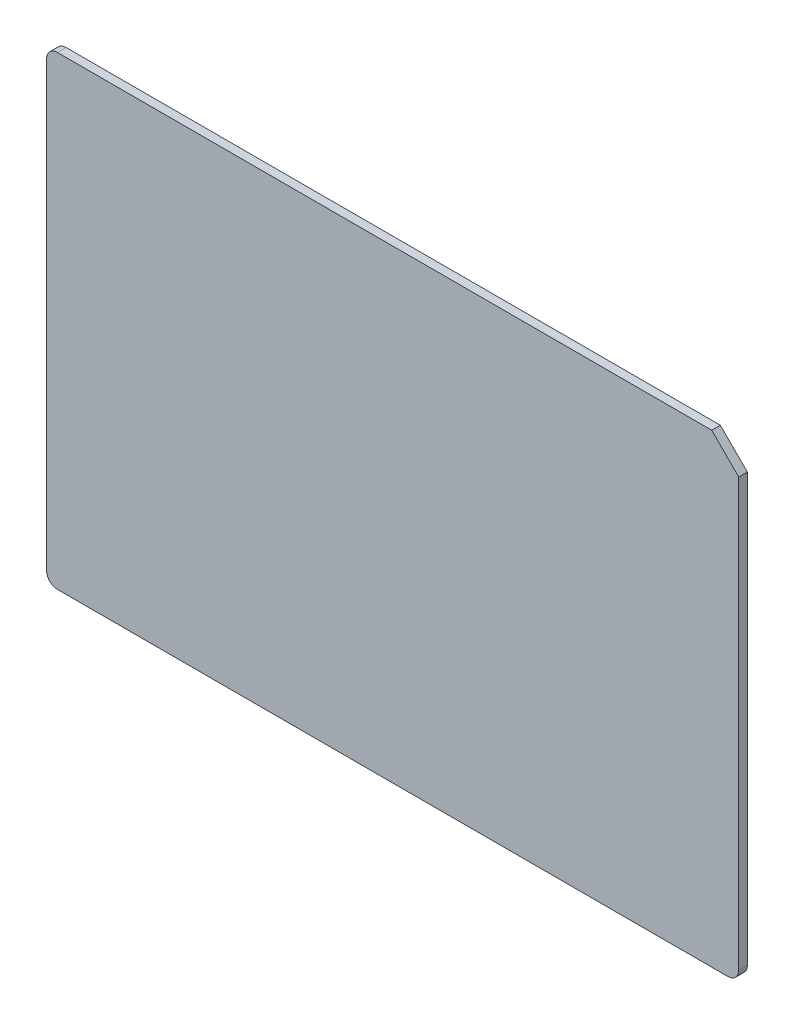
ISO-10303-21;
HEADER;
FILE_DESCRIPTION(('STEP AP214'),'2;1');
FILE_NAME('part.step','',(''),(''),'','','');
FILE_SCHEMA(('AUTOMOTIVE_DESIGN { 1 0 10303 214 1 1 1 1 }'));
ENDSEC;
DATA;
#1=APPLICATION_CONTEXT('core data for automotive mechanical design processes');
#2=APPLICATION_PROTOCOL_DEFINITION('international standard','automotive_design',2000,#1);
#3=PRODUCT_CONTEXT('',#1,'mechanical');
#4=PRODUCT('Part','Part','',(#3));
#5=PRODUCT_RELATED_PRODUCT_CATEGORY('part','',(#4));
#6=PRODUCT_DEFINITION_FORMATION('','',#4);
#7=PRODUCT_DEFINITION_CONTEXT('part definition',#1,'design');
#8=PRODUCT_DEFINITION('design','',#6,#7);
#9=PRODUCT_DEFINITION_SHAPE('','',#8);
#10=(LENGTH_UNIT() NAMED_UNIT(*) SI_UNIT(.MILLI.,.METRE.));
#11=(NAMED_UNIT(*) PLANE_ANGLE_UNIT() SI_UNIT($,.RADIAN.));
#12=(NAMED_UNIT(*) SI_UNIT($,.STERADIAN.) SOLID_ANGLE_UNIT());
#13=UNCERTAINTY_MEASURE_WITH_UNIT(LENGTH_MEASURE(1.E-05),#10,'distance_accuracy_value','');
#14=(GEOMETRIC_REPRESENTATION_CONTEXT(3) GLOBAL_UNCERTAINTY_ASSIGNED_CONTEXT((#13)) GLOBAL_UNIT_ASSIGNED_CONTEXT((#10,
#11,#12)) REPRESENTATION_CONTEXT('',''));
#15=CARTESIAN_POINT('',(0.,0.,0.));
#16=DIRECTION('',(0.,0.,1.));
#17=DIRECTION('',(1.,0.,0.));
#18=AXIS2_PLACEMENT_3D('',#15,#16,#17);
#19=CARTESIAN_POINT('',(-0.246334872944926,79.8981912395955,1.6));
#20=DIRECTION('',(0.,0.,-1.));
#21=DIRECTION('',(-1.,0.,0.));
#22=AXIS2_PLACEMENT_3D('',#19,#20,#21);
#23=CYLINDRICAL_SURFACE('',#22,2.);
#24=CARTESIAN_POINT('',(-0.246334872944926,79.8981912395955,0.));
#25=DIRECTION('',(0.,0.,1.));
#26=DIRECTION('',(1.,0.,0.));
#27=AXIS2_PLACEMENT_3D('',#24,#25,#26);
#28=CIRCLE('',#27,2.);
#29=CARTESIAN_POINT('',(-0.246334872944926,81.8981912395955,0.));
#30=VERTEX_POINT('',#29);
#31=CARTESIAN_POINT('',(-2.24633487294493,79.8981912395955,0.));
#32=VERTEX_POINT('',#31);
#33=EDGE_CURVE('E128',#30,#32,#28,.T.);
#34=ORIENTED_EDGE('',*,*,#33,.T.);
#35=DIRECTION('',(0.,0.,-1.));
#36=VECTOR('',#35,1.);
#37=CARTESIAN_POINT('',(-2.24633487294493,79.8981912395955,1.6));
#38=LINE('',#37,#36);
#39=CARTESIAN_POINT('',(-2.24633487294493,79.8981912395955,1.6));
#40=VERTEX_POINT('',#39);
#41=EDGE_CURVE('E11',#40,#32,#38,.T.);
#42=ORIENTED_EDGE('',*,*,#41,.F.);
#43=CARTESIAN_POINT('',(-0.246334872944926,79.8981912395955,1.6));
#44=DIRECTION('',(0.,0.,1.));
#45=DIRECTION('',(1.,0.,0.));
#46=AXIS2_PLACEMENT_3D('',#43,#44,#45);
#47=CIRCLE('',#46,2.);
#48=CARTESIAN_POINT('',(-0.246334872944926,81.8981912395955,1.6));
#49=VERTEX_POINT('',#48);
#50=EDGE_CURVE('E142',#49,#40,#47,.T.);
#51=ORIENTED_EDGE('',*,*,#50,.F.);
#52=DIRECTION('',(0.,0.,-1.));
#53=VECTOR('',#52,1.);
#54=CARTESIAN_POINT('',(-0.246334872944926,81.8981912395955,1.6));
#55=LINE('',#54,#53);
#56=EDGE_CURVE('E124',#49,#30,#55,.T.);
#57=ORIENTED_EDGE('',*,*,#56,.T.);
#58=EDGE_LOOP('',(#34,#42,#51,#57));
#59=FACE_BOUND('',#58,.T.);
#60=ADVANCED_FACE('F32',(#59),#23,.T.);
#61=CARTESIAN_POINT('',(-2.24633487294493,79.8981912395955,1.6));
#62=DIRECTION('',(1.,0.,0.));
#63=DIRECTION('',(0.,0.,-1.));
#64=AXIS2_PLACEMENT_3D('',#61,#62,#63);
#65=PLANE('',#64);
#66=DIRECTION('',(0.,-1.,0.));
#67=VECTOR('',#66,1.);
#68=CARTESIAN_POINT('',(-2.24633487294493,79.8981912395955,0.));
#69=LINE('',#68,#67);
#70=CARTESIAN_POINT('',(-2.24633487294493,-2.10180875804453,0.));
#71=VERTEX_POINT('',#70);
#72=EDGE_CURVE('E131',#32,#71,#69,.T.);
#73=ORIENTED_EDGE('',*,*,#72,.T.);
#74=DIRECTION('',(0.,0.,-1.));
#75=VECTOR('',#74,1.);
#76=CARTESIAN_POINT('',(-2.24633487294493,-2.10180875804453,1.6));
#77=LINE('',#76,#75);
#78=CARTESIAN_POINT('',(-2.24633487294493,-2.10180875804453,1.6));
#79=VERTEX_POINT('',#78);
#80=EDGE_CURVE('E40',#79,#71,#77,.T.);
#81=ORIENTED_EDGE('',*,*,#80,.F.);
#82=DIRECTION('',(0.,-1.,0.));
#83=VECTOR('',#82,1.);
#84=CARTESIAN_POINT('',(-2.24633487294493,79.8981912395955,1.6));
#85=LINE('',#84,#83);
#86=EDGE_CURVE('E91',#40,#79,#85,.T.);
#87=ORIENTED_EDGE('',*,*,#86,.F.);
#88=ORIENTED_EDGE('',*,*,#41,.T.);
#89=EDGE_LOOP('',(#73,#81,#87,#88));
#90=FACE_BOUND('',#89,.T.);
#91=ADVANCED_FACE('F177',(#90),#65,.F.);
#92=CARTESIAN_POINT('',(-0.246334872694931,-2.10180875804453,1.6));
#93=DIRECTION('',(0.,0.,-1.));
#94=DIRECTION('',(-1.,0.,0.));
#95=AXIS2_PLACEMENT_3D('',#92,#93,#94);
#96=CYLINDRICAL_SURFACE('',#95,2.00000000025);
#97=CARTESIAN_POINT('',(-0.246334872694931,-2.10180875804453,0.));
#98=DIRECTION('',(0.,0.,1.));
#99=DIRECTION('',(1.,0.,0.));
#100=AXIS2_PLACEMENT_3D('',#97,#98,#99);
#101=CIRCLE('',#100,2.00000000025);
#102=CARTESIAN_POINT('',(-0.246334872694931,-4.10180875829454,0.));
#103=VERTEX_POINT('',#102);
#104=EDGE_CURVE('E133',#71,#103,#101,.T.);
#105=ORIENTED_EDGE('',*,*,#104,.T.);
#106=DIRECTION('',(0.,0.,-1.));
#107=VECTOR('',#106,1.);
#108=CARTESIAN_POINT('',(-0.246334872694931,-4.10180875829454,1.6));
#109=LINE('',#108,#107);
#110=CARTESIAN_POINT('',(-0.246334872694931,-4.10180875829454,1.6));
#111=VERTEX_POINT('',#110);
#112=EDGE_CURVE('E149',#111,#103,#109,.T.);
#113=ORIENTED_EDGE('',*,*,#112,.F.);
#114=CARTESIAN_POINT('',(-0.246334872694931,-2.10180875804453,1.6));
#115=DIRECTION('',(0.,0.,1.));
#116=DIRECTION('',(1.,0.,0.));
#117=AXIS2_PLACEMENT_3D('',#114,#115,#116);
#118=CIRCLE('',#117,2.00000000025);
#119=EDGE_CURVE('E157',#79,#111,#118,.T.);
#120=ORIENTED_EDGE('',*,*,#119,.F.);
#121=ORIENTED_EDGE('',*,*,#80,.T.);
#122=EDGE_LOOP('',(#105,#113,#120,#121));
#123=FACE_BOUND('',#122,.T.);
#124=ADVANCED_FACE('F155',(#123),#96,.T.);
#125=CARTESIAN_POINT('',(-0.246334872694931,-4.10180875829454,1.6));
#126=DIRECTION('',(0.,1.,0.));
#127=DIRECTION('',(0.,0.,1.));
#128=AXIS2_PLACEMENT_3D('',#125,#126,#127);
#129=PLANE('',#128);
#130=DIRECTION('',(1.,0.,0.));
#131=VECTOR('',#130,1.);
#132=CARTESIAN_POINT('',(-0.246334872694931,-4.10180875829454,0.));
#133=LINE('',#132,#131);
#134=CARTESIAN_POINT('',(123.753665127825,-4.10180875829454,0.));
#135=VERTEX_POINT('',#134);
#136=EDGE_CURVE('E135',#103,#135,#133,.T.);
#137=ORIENTED_EDGE('',*,*,#136,.T.);
#138=DIRECTION('',(0.,0.,-1.));
#139=VECTOR('',#138,1.);
#140=CARTESIAN_POINT('',(123.753665127825,-4.10180875829454,1.6));
#141=LINE('',#140,#139);
#142=CARTESIAN_POINT('',(123.753665127825,-4.10180875829454,1.6));
#143=VERTEX_POINT('',#142);
#144=EDGE_CURVE('E146',#143,#135,#141,.T.);
#145=ORIENTED_EDGE('',*,*,#144,.F.);
#146=DIRECTION('',(1.,0.,0.));
#147=VECTOR('',#146,1.);
#148=CARTESIAN_POINT('',(-0.246334872694931,-4.10180875829454,1.6));
#149=LINE('',#148,#147);
#150=EDGE_CURVE('E169',#111,#143,#149,.T.);
#151=ORIENTED_EDGE('',*,*,#150,.F.);
#152=ORIENTED_EDGE('',*,*,#112,.T.);
#153=EDGE_LOOP('',(#137,#145,#151,#152));
#154=FACE_BOUND('',#153,.T.);
#155=ADVANCED_FACE('F165',(#154),#129,.F.);
#156=CARTESIAN_POINT('',(123.753665127825,-2.10180875804454,1.6));
#157=DIRECTION('',(0.,0.,-1.));
#158=DIRECTION('',(-1.,0.,0.));
#159=AXIS2_PLACEMENT_3D('',#156,#157,#158);
#160=CYLINDRICAL_SURFACE('',#159,2.00000000025);
#161=CARTESIAN_POINT('',(123.753665127825,-2.10180875804454,0.));
#162=DIRECTION('',(0.,0.,1.));
#163=DIRECTION('',(1.,0.,0.));
#164=AXIS2_PLACEMENT_3D('',#161,#162,#163);
#165=CIRCLE('',#164,2.00000000025);
#166=CARTESIAN_POINT('',(125.753665128075,-2.10180875804454,0.));
#167=VERTEX_POINT('',#166);
#168=EDGE_CURVE('E137',#135,#167,#165,.T.);
#169=ORIENTED_EDGE('',*,*,#168,.T.);
#170=DIRECTION('',(0.,0.,-1.));
#171=VECTOR('',#170,1.);
#172=CARTESIAN_POINT('',(125.753665128075,-2.10180875804454,1.6));
#173=LINE('',#172,#171);
#174=CARTESIAN_POINT('',(125.753665128075,-2.10180875804454,1.6));
#175=VERTEX_POINT('',#174);
#176=EDGE_CURVE('E119',#175,#167,#173,.T.);
#177=ORIENTED_EDGE('',*,*,#176,.F.);
#178=CARTESIAN_POINT('',(123.753665127825,-2.10180875804454,1.6));
#179=DIRECTION('',(0.,0.,1.));
#180=DIRECTION('',(1.,0.,0.));
#181=AXIS2_PLACEMENT_3D('',#178,#179,#180);
#182=CIRCLE('',#181,2.00000000025);
#183=EDGE_CURVE('E110',#143,#175,#182,.T.);
#184=ORIENTED_EDGE('',*,*,#183,.F.);
#185=ORIENTED_EDGE('',*,*,#144,.T.);
#186=EDGE_LOOP('',(#169,#177,#184,#185));
#187=FACE_BOUND('',#186,.T.);
#188=ADVANCED_FACE('F168',(#187),#160,.T.);
#189=CARTESIAN_POINT('',(125.753665128075,-2.10180875804454,1.6));
#190=DIRECTION('',(-1.,0.,0.));
#191=DIRECTION('',(0.,0.,1.));
#192=AXIS2_PLACEMENT_3D('',#189,#190,#191);
#193=PLANE('',#192);
#194=DIRECTION('',(0.,1.,0.));
#195=VECTOR('',#194,1.);
#196=CARTESIAN_POINT('',(125.753665128075,-2.10180875804454,0.));
#197=LINE('',#196,#195);
#198=CARTESIAN_POINT('',(125.753665128075,76.8981912396155,0.));
#199=VERTEX_POINT('',#198);
#200=EDGE_CURVE('E118',#167,#199,#197,.T.);
#201=ORIENTED_EDGE('',*,*,#200,.T.);
#202=DIRECTION('',(0.,0.,-1.));
#203=VECTOR('',#202,1.);
#204=CARTESIAN_POINT('',(125.753665128075,76.8981912396155,1.6));
#205=LINE('',#204,#203);
#206=CARTESIAN_POINT('',(125.753665128075,76.8981912396155,1.6));
#207=VERTEX_POINT('',#206);
#208=EDGE_CURVE('E115',#207,#199,#205,.T.);
#209=ORIENTED_EDGE('',*,*,#208,.F.);
#210=DIRECTION('',(0.,1.,0.));
#211=VECTOR('',#210,1.);
#212=CARTESIAN_POINT('',(125.753665128075,-2.10180875804454,1.6));
#213=LINE('',#212,#211);
#214=EDGE_CURVE('E104',#175,#207,#213,.T.);
#215=ORIENTED_EDGE('',*,*,#214,.F.);
#216=ORIENTED_EDGE('',*,*,#176,.T.);
#217=EDGE_LOOP('',(#201,#209,#215,#216));
#218=FACE_BOUND('',#217,.T.);
#219=ADVANCED_FACE('F116',(#218),#193,.F.);
#220=CARTESIAN_POINT('',(125.753665128075,76.8981912396155,1.6));
#221=DIRECTION('',(-0.707106781186548,-0.707106781186548,0.));
#222=DIRECTION('',(0.707106781186548,-0.707106781186548,0.));
#223=AXIS2_PLACEMENT_3D('',#220,#221,#222);
#224=PLANE('',#223);
#225=DIRECTION('',(-0.707106781186548,0.707106781186548,0.));
#226=VECTOR('',#225,1.);
#227=CARTESIAN_POINT('',(125.753665128075,76.8981912396155,0.));
#228=LINE('',#227,#226);
#229=CARTESIAN_POINT('',(120.753665128095,81.8981912395955,0.));
#230=VERTEX_POINT('',#229);
#231=EDGE_CURVE('E77',#199,#230,#228,.T.);
#232=ORIENTED_EDGE('',*,*,#231,.T.);
#233=DIRECTION('',(0.,0.,-1.));
#234=VECTOR('',#233,1.);
#235=CARTESIAN_POINT('',(120.753665128095,81.8981912395955,1.6));
#236=LINE('',#235,#234);
#237=CARTESIAN_POINT('',(120.753665128095,81.8981912395955,1.6));
#238=VERTEX_POINT('',#237);
#239=EDGE_CURVE('E120',#238,#230,#236,.T.);
#240=ORIENTED_EDGE('',*,*,#239,.F.);
#241=DIRECTION('',(-0.707106781186548,0.707106781186548,0.));
#242=VECTOR('',#241,1.);
#243=CARTESIAN_POINT('',(125.753665128075,76.8981912396155,1.6));
#244=LINE('',#243,#242);
#245=EDGE_CURVE('E108',#207,#238,#244,.T.);
#246=ORIENTED_EDGE('',*,*,#245,.F.);
#247=ORIENTED_EDGE('',*,*,#208,.T.);
#248=EDGE_LOOP('',(#232,#240,#246,#247));
#249=FACE_BOUND('',#248,.T.);
#250=ADVANCED_FACE('F122',(#249),#224,.F.);
#251=CARTESIAN_POINT('',(120.753665128095,81.8981912395955,1.6));
#252=DIRECTION('',(0.,-1.,0.));
#253=DIRECTION('',(0.,0.,-1.));
#254=AXIS2_PLACEMENT_3D('',#251,#252,#253);
#255=PLANE('',#254);
#256=DIRECTION('',(-1.,0.,0.));
#257=VECTOR('',#256,1.);
#258=CARTESIAN_POINT('',(120.753665128095,81.8981912395955,0.));
#259=LINE('',#258,#257);
#260=EDGE_CURVE('E83',#230,#30,#259,.T.);
#261=ORIENTED_EDGE('',*,*,#260,.T.);
#262=ORIENTED_EDGE('',*,*,#56,.F.);
#263=DIRECTION('',(-1.,0.,0.));
#264=VECTOR('',#263,1.);
#265=CARTESIAN_POINT('',(120.753665128095,81.8981912395955,1.6));
#266=LINE('',#265,#264);
#267=EDGE_CURVE('E48',#238,#49,#266,.T.);
#268=ORIENTED_EDGE('',*,*,#267,.F.);
#269=ORIENTED_EDGE('',*,*,#239,.T.);
#270=EDGE_LOOP('',(#261,#262,#268,#269));
#271=FACE_BOUND('',#270,.T.);
#272=ADVANCED_FACE('F193',(#271),#255,.F.);
#273=CARTESIAN_POINT('',(-0.246334872944926,79.8981912395955,1.6));
#274=DIRECTION('',(0.,0.,1.));
#275=DIRECTION('',(1.,0.,0.));
#276=AXIS2_PLACEMENT_3D('',#273,#274,#275);
#277=PLANE('',#276);
#278=ORIENTED_EDGE('',*,*,#50,.T.);
#279=ORIENTED_EDGE('',*,*,#86,.T.);
#280=ORIENTED_EDGE('',*,*,#119,.T.);
#281=ORIENTED_EDGE('',*,*,#150,.T.);
#282=ORIENTED_EDGE('',*,*,#183,.T.);
#283=ORIENTED_EDGE('',*,*,#214,.T.);
#284=ORIENTED_EDGE('',*,*,#245,.T.);
#285=ORIENTED_EDGE('',*,*,#267,.T.);
#286=EDGE_LOOP('',(#278,#279,#280,#281,#282,#283,#284,#285));
#287=FACE_BOUND('',#286,.T.);
#288=ADVANCED_FACE('F106',(#287),#277,.T.);
#289=CARTESIAN_POINT('',(-0.246334872944926,79.8981912395955,0.));
#290=DIRECTION('',(0.,0.,1.));
#291=DIRECTION('',(1.,0.,0.));
#292=AXIS2_PLACEMENT_3D('',#289,#290,#291);
#293=PLANE('',#292);
#294=ORIENTED_EDGE('',*,*,#33,.F.);
#295=ORIENTED_EDGE('',*,*,#260,.F.);
#296=ORIENTED_EDGE('',*,*,#231,.F.);
#297=ORIENTED_EDGE('',*,*,#200,.F.);
#298=ORIENTED_EDGE('',*,*,#168,.F.);
#299=ORIENTED_EDGE('',*,*,#136,.F.);
#300=ORIENTED_EDGE('',*,*,#104,.F.);
#301=ORIENTED_EDGE('',*,*,#72,.F.);
#302=EDGE_LOOP('',(#294,#295,#296,#297,#298,#299,#300,#301));
#303=FACE_BOUND('',#302,.T.);
#304=ADVANCED_FACE('F161',(#303),#293,.F.);
#305=CLOSED_SHELL('',(#60,#91,#124,#155,#188,#219,#250,#272,#288,#304));
#306=MANIFOLD_SOLID_BREP('B2',#305);
#307=ADVANCED_BREP_SHAPE_REPRESENTATION('',(#18,#306),#14);
#308=SHAPE_DEFINITION_REPRESENTATION(#9,#307);
ENDSEC;
END-ISO-10303-21;
